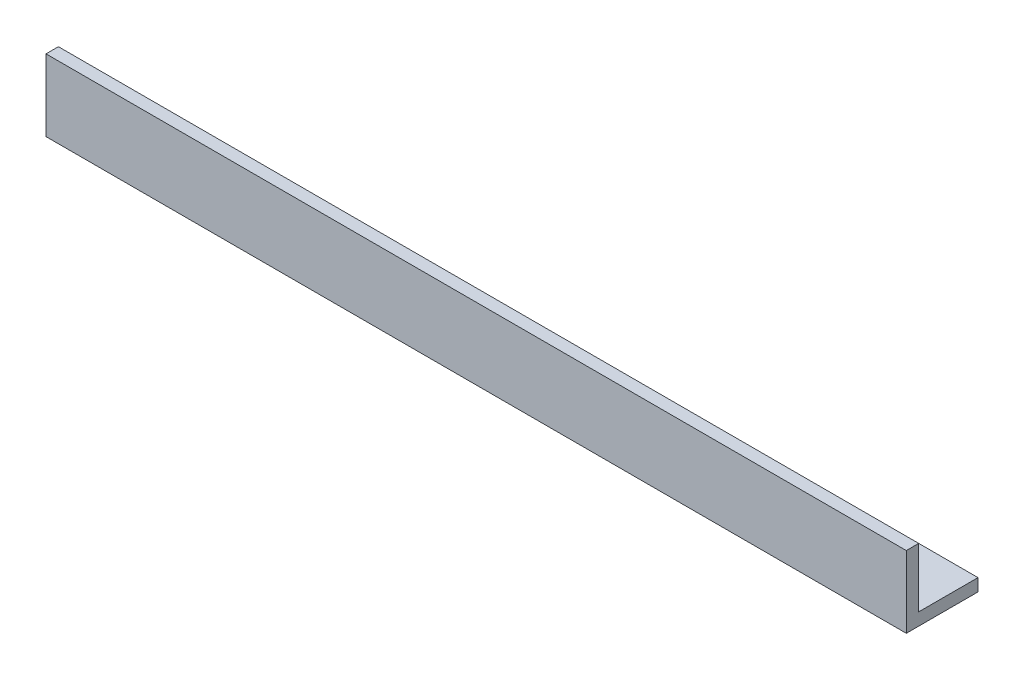
ISO-10303-21;
HEADER;
FILE_DESCRIPTION(('STEP AP214'),'2;1');
FILE_NAME('part.step','',(''),(''),'','','');
FILE_SCHEMA(('AUTOMOTIVE_DESIGN { 1 0 10303 214 1 1 1 1 }'));
ENDSEC;
DATA;
#1=APPLICATION_CONTEXT('core data for automotive mechanical design processes');
#2=APPLICATION_PROTOCOL_DEFINITION('international standard','automotive_design',2000,#1);
#3=PRODUCT_CONTEXT('',#1,'mechanical');
#4=PRODUCT('Part','Part','',(#3));
#5=PRODUCT_RELATED_PRODUCT_CATEGORY('part','',(#4));
#6=PRODUCT_DEFINITION_FORMATION('','',#4);
#7=PRODUCT_DEFINITION_CONTEXT('part definition',#1,'design');
#8=PRODUCT_DEFINITION('design','',#6,#7);
#9=PRODUCT_DEFINITION_SHAPE('','',#8);
#10=(LENGTH_UNIT() NAMED_UNIT(*) SI_UNIT(.MILLI.,.METRE.));
#11=(NAMED_UNIT(*) PLANE_ANGLE_UNIT() SI_UNIT($,.RADIAN.));
#12=(NAMED_UNIT(*) SI_UNIT($,.STERADIAN.) SOLID_ANGLE_UNIT());
#13=UNCERTAINTY_MEASURE_WITH_UNIT(LENGTH_MEASURE(1.E-05),#10,'distance_accuracy_value','');
#14=(GEOMETRIC_REPRESENTATION_CONTEXT(3) GLOBAL_UNCERTAINTY_ASSIGNED_CONTEXT((#13)) GLOBAL_UNIT_ASSIGNED_CONTEXT((#10,
#11,#12)) REPRESENTATION_CONTEXT('',''));
#15=CARTESIAN_POINT('',(0.,0.,0.));
#16=DIRECTION('',(0.,0.,1.));
#17=DIRECTION('',(1.,0.,0.));
#18=AXIS2_PLACEMENT_3D('',#15,#16,#17);
#19=CARTESIAN_POINT('',(240.,20.,0.));
#20=DIRECTION('',(0.,0.,-1.));
#21=DIRECTION('',(0.,1.,0.));
#22=AXIS2_PLACEMENT_3D('',#19,#20,#21);
#23=PLANE('',#22);
#24=DIRECTION('',(0.,-1.,0.));
#25=VECTOR('',#24,1.);
#26=CARTESIAN_POINT('',(0.,20.,0.));
#27=LINE('',#26,#25);
#28=CARTESIAN_POINT('',(0.,20.,0.));
#29=VERTEX_POINT('',#28);
#30=CARTESIAN_POINT('',(0.,0.,0.));
#31=VERTEX_POINT('',#30);
#32=EDGE_CURVE('E121',#29,#31,#27,.T.);
#33=ORIENTED_EDGE('',*,*,#32,.T.);
#34=DIRECTION('',(-1.,0.,0.));
#35=VECTOR('',#34,1.);
#36=CARTESIAN_POINT('',(240.,0.,0.));
#37=LINE('',#36,#35);
#38=CARTESIAN_POINT('',(240.,0.,0.));
#39=VERTEX_POINT('',#38);
#40=EDGE_CURVE('E11',#39,#31,#37,.T.);
#41=ORIENTED_EDGE('',*,*,#40,.F.);
#42=DIRECTION('',(0.,-1.,0.));
#43=VECTOR('',#42,1.);
#44=CARTESIAN_POINT('',(240.,20.,0.));
#45=LINE('',#44,#43);
#46=CARTESIAN_POINT('',(240.,20.,0.));
#47=VERTEX_POINT('',#46);
#48=EDGE_CURVE('E131',#47,#39,#45,.T.);
#49=ORIENTED_EDGE('',*,*,#48,.F.);
#50=DIRECTION('',(-1.,0.,0.));
#51=VECTOR('',#50,1.);
#52=CARTESIAN_POINT('',(240.,20.,0.));
#53=LINE('',#52,#51);
#54=EDGE_CURVE('E117',#47,#29,#53,.T.);
#55=ORIENTED_EDGE('',*,*,#54,.T.);
#56=EDGE_LOOP('',(#33,#41,#49,#55));
#57=FACE_BOUND('',#56,.T.);
#58=ADVANCED_FACE('F37',(#57),#23,.F.);
#59=CARTESIAN_POINT('',(240.,0.,0.));
#60=DIRECTION('',(0.,1.,0.));
#61=DIRECTION('',(0.,0.,1.));
#62=AXIS2_PLACEMENT_3D('',#59,#60,#61);
#63=PLANE('',#62);
#64=DIRECTION('',(0.,0.,-1.));
#65=VECTOR('',#64,1.);
#66=CARTESIAN_POINT('',(0.,0.,0.));
#67=LINE('',#66,#65);
#68=CARTESIAN_POINT('',(0.,0.,-20.));
#69=VERTEX_POINT('',#68);
#70=EDGE_CURVE('E124',#31,#69,#67,.T.);
#71=ORIENTED_EDGE('',*,*,#70,.T.);
#72=DIRECTION('',(-1.,0.,0.));
#73=VECTOR('',#72,1.);
#74=CARTESIAN_POINT('',(240.,0.,-20.));
#75=LINE('',#74,#73);
#76=CARTESIAN_POINT('',(240.,0.,-20.));
#77=VERTEX_POINT('',#76);
#78=EDGE_CURVE('E45',#77,#69,#75,.T.);
#79=ORIENTED_EDGE('',*,*,#78,.F.);
#80=DIRECTION('',(0.,0.,-1.));
#81=VECTOR('',#80,1.);
#82=CARTESIAN_POINT('',(240.,0.,0.));
#83=LINE('',#82,#81);
#84=EDGE_CURVE('E90',#39,#77,#83,.T.);
#85=ORIENTED_EDGE('',*,*,#84,.F.);
#86=ORIENTED_EDGE('',*,*,#40,.T.);
#87=EDGE_LOOP('',(#71,#79,#85,#86));
#88=FACE_BOUND('',#87,.T.);
#89=ADVANCED_FACE('F155',(#88),#63,.F.);
#90=CARTESIAN_POINT('',(240.,0.,-20.));
#91=DIRECTION('',(0.,0.,1.));
#92=DIRECTION('',(1.,0.,0.));
#93=AXIS2_PLACEMENT_3D('',#90,#91,#92);
#94=PLANE('',#93);
#95=DIRECTION('',(0.,1.,0.));
#96=VECTOR('',#95,1.);
#97=CARTESIAN_POINT('',(0.,0.,-20.));
#98=LINE('',#97,#96);
#99=CARTESIAN_POINT('',(0.,3.46117846701572,-20.));
#100=VERTEX_POINT('',#99);
#101=EDGE_CURVE('E126',#69,#100,#98,.T.);
#102=ORIENTED_EDGE('',*,*,#101,.T.);
#103=DIRECTION('',(-1.,0.,0.));
#104=VECTOR('',#103,1.);
#105=CARTESIAN_POINT('',(240.,3.46117846701572,-20.));
#106=LINE('',#105,#104);
#107=CARTESIAN_POINT('',(240.,3.46117846701572,-20.));
#108=VERTEX_POINT('',#107);
#109=EDGE_CURVE('E112',#108,#100,#106,.T.);
#110=ORIENTED_EDGE('',*,*,#109,.F.);
#111=DIRECTION('',(0.,1.,0.));
#112=VECTOR('',#111,1.);
#113=CARTESIAN_POINT('',(240.,0.,-20.));
#114=LINE('',#113,#112);
#115=EDGE_CURVE('E103',#77,#108,#114,.T.);
#116=ORIENTED_EDGE('',*,*,#115,.F.);
#117=ORIENTED_EDGE('',*,*,#78,.T.);
#118=EDGE_LOOP('',(#102,#110,#116,#117));
#119=FACE_BOUND('',#118,.T.);
#120=ADVANCED_FACE('F137',(#119),#94,.F.);
#121=CARTESIAN_POINT('',(240.,3.46117846701572,-20.));
#122=DIRECTION('',(0.,-1.,0.));
#123=DIRECTION('',(0.,0.,-1.));
#124=AXIS2_PLACEMENT_3D('',#121,#122,#123);
#125=PLANE('',#124);
#126=DIRECTION('',(0.,0.,1.));
#127=VECTOR('',#126,1.);
#128=CARTESIAN_POINT('',(0.,3.46117846701572,-20.));
#129=LINE('',#128,#127);
#130=CARTESIAN_POINT('',(0.,3.46117846701572,-3.46117846701572));
#131=VERTEX_POINT('',#130);
#132=EDGE_CURVE('E111',#100,#131,#129,.T.);
#133=ORIENTED_EDGE('',*,*,#132,.T.);
#134=DIRECTION('',(-1.,0.,0.));
#135=VECTOR('',#134,1.);
#136=CARTESIAN_POINT('',(240.,3.46117846701572,-3.46117846701572));
#137=LINE('',#136,#135);
#138=CARTESIAN_POINT('',(240.,3.46117846701572,-3.46117846701572));
#139=VERTEX_POINT('',#138);
#140=EDGE_CURVE('E108',#139,#131,#137,.T.);
#141=ORIENTED_EDGE('',*,*,#140,.F.);
#142=DIRECTION('',(0.,0.,1.));
#143=VECTOR('',#142,1.);
#144=CARTESIAN_POINT('',(240.,3.46117846701572,-20.));
#145=LINE('',#144,#143);
#146=EDGE_CURVE('E97',#108,#139,#145,.T.);
#147=ORIENTED_EDGE('',*,*,#146,.F.);
#148=ORIENTED_EDGE('',*,*,#109,.T.);
#149=EDGE_LOOP('',(#133,#141,#147,#148));
#150=FACE_BOUND('',#149,.T.);
#151=ADVANCED_FACE('F109',(#150),#125,.F.);
#152=CARTESIAN_POINT('',(240.,3.46117846701572,-3.46117846701572));
#153=DIRECTION('',(0.,0.,1.));
#154=DIRECTION('',(1.,0.,0.));
#155=AXIS2_PLACEMENT_3D('',#152,#153,#154);
#156=PLANE('',#155);
#157=DIRECTION('',(0.,1.,0.));
#158=VECTOR('',#157,1.);
#159=CARTESIAN_POINT('',(0.,3.46117846701572,-3.46117846701572));
#160=LINE('',#159,#158);
#161=CARTESIAN_POINT('',(0.,20.,-3.46117846701572));
#162=VERTEX_POINT('',#161);
#163=EDGE_CURVE('E76',#131,#162,#160,.T.);
#164=ORIENTED_EDGE('',*,*,#163,.T.);
#165=DIRECTION('',(-1.,0.,0.));
#166=VECTOR('',#165,1.);
#167=CARTESIAN_POINT('',(240.,20.,-3.46117846701572));
#168=LINE('',#167,#166);
#169=CARTESIAN_POINT('',(240.,20.,-3.46117846701572));
#170=VERTEX_POINT('',#169);
#171=EDGE_CURVE('E113',#170,#162,#168,.T.);
#172=ORIENTED_EDGE('',*,*,#171,.F.);
#173=DIRECTION('',(0.,1.,0.));
#174=VECTOR('',#173,1.);
#175=CARTESIAN_POINT('',(240.,3.46117846701572,-3.46117846701572));
#176=LINE('',#175,#174);
#177=EDGE_CURVE('E101',#139,#170,#176,.T.);
#178=ORIENTED_EDGE('',*,*,#177,.F.);
#179=ORIENTED_EDGE('',*,*,#140,.T.);
#180=EDGE_LOOP('',(#164,#172,#178,#179));
#181=FACE_BOUND('',#180,.T.);
#182=ADVANCED_FACE('F115',(#181),#156,.F.);
#183=CARTESIAN_POINT('',(240.,20.,-3.46117846701572));
#184=DIRECTION('',(0.,-1.,0.));
#185=DIRECTION('',(0.,0.,-1.));
#186=AXIS2_PLACEMENT_3D('',#183,#184,#185);
#187=PLANE('',#186);
#188=DIRECTION('',(0.,0.,1.));
#189=VECTOR('',#188,1.);
#190=CARTESIAN_POINT('',(0.,20.,-3.46117846701572));
#191=LINE('',#190,#189);
#192=EDGE_CURVE('E82',#162,#29,#191,.T.);
#193=ORIENTED_EDGE('',*,*,#192,.T.);
#194=ORIENTED_EDGE('',*,*,#54,.F.);
#195=DIRECTION('',(0.,0.,1.));
#196=VECTOR('',#195,1.);
#197=CARTESIAN_POINT('',(240.,20.,-3.46117846701572));
#198=LINE('',#197,#196);
#199=EDGE_CURVE('E53',#170,#47,#198,.T.);
#200=ORIENTED_EDGE('',*,*,#199,.F.);
#201=ORIENTED_EDGE('',*,*,#171,.T.);
#202=EDGE_LOOP('',(#193,#194,#200,#201));
#203=FACE_BOUND('',#202,.T.);
#204=ADVANCED_FACE('F144',(#203),#187,.F.);
#205=CARTESIAN_POINT('',(240.,0.,0.));
#206=DIRECTION('',(1.,0.,0.));
#207=DIRECTION('',(0.,0.,-1.));
#208=AXIS2_PLACEMENT_3D('',#205,#206,#207);
#209=PLANE('',#208);
#210=ORIENTED_EDGE('',*,*,#48,.T.);
#211=ORIENTED_EDGE('',*,*,#84,.T.);
#212=ORIENTED_EDGE('',*,*,#115,.T.);
#213=ORIENTED_EDGE('',*,*,#146,.T.);
#214=ORIENTED_EDGE('',*,*,#177,.T.);
#215=ORIENTED_EDGE('',*,*,#199,.T.);
#216=EDGE_LOOP('',(#210,#211,#212,#213,#214,#215));
#217=FACE_BOUND('',#216,.T.);
#218=ADVANCED_FACE('F99',(#217),#209,.T.);
#219=CARTESIAN_POINT('',(0.,0.,0.));
#220=DIRECTION('',(1.,0.,0.));
#221=DIRECTION('',(0.,0.,-1.));
#222=AXIS2_PLACEMENT_3D('',#219,#220,#221);
#223=PLANE('',#222);
#224=ORIENTED_EDGE('',*,*,#32,.F.);
#225=ORIENTED_EDGE('',*,*,#192,.F.);
#226=ORIENTED_EDGE('',*,*,#163,.F.);
#227=ORIENTED_EDGE('',*,*,#132,.F.);
#228=ORIENTED_EDGE('',*,*,#101,.F.);
#229=ORIENTED_EDGE('',*,*,#70,.F.);
#230=EDGE_LOOP('',(#224,#225,#226,#227,#228,#229));
#231=FACE_BOUND('',#230,.T.);
#232=ADVANCED_FACE('F140',(#231),#223,.F.);
#233=CLOSED_SHELL('',(#58,#89,#120,#151,#182,#204,#218,#232));
#234=MANIFOLD_SOLID_BREP('B2',#233);
#235=ADVANCED_BREP_SHAPE_REPRESENTATION('',(#18,#234),#14);
#236=SHAPE_DEFINITION_REPRESENTATION(#9,#235);
ENDSEC;
END-ISO-10303-21;
